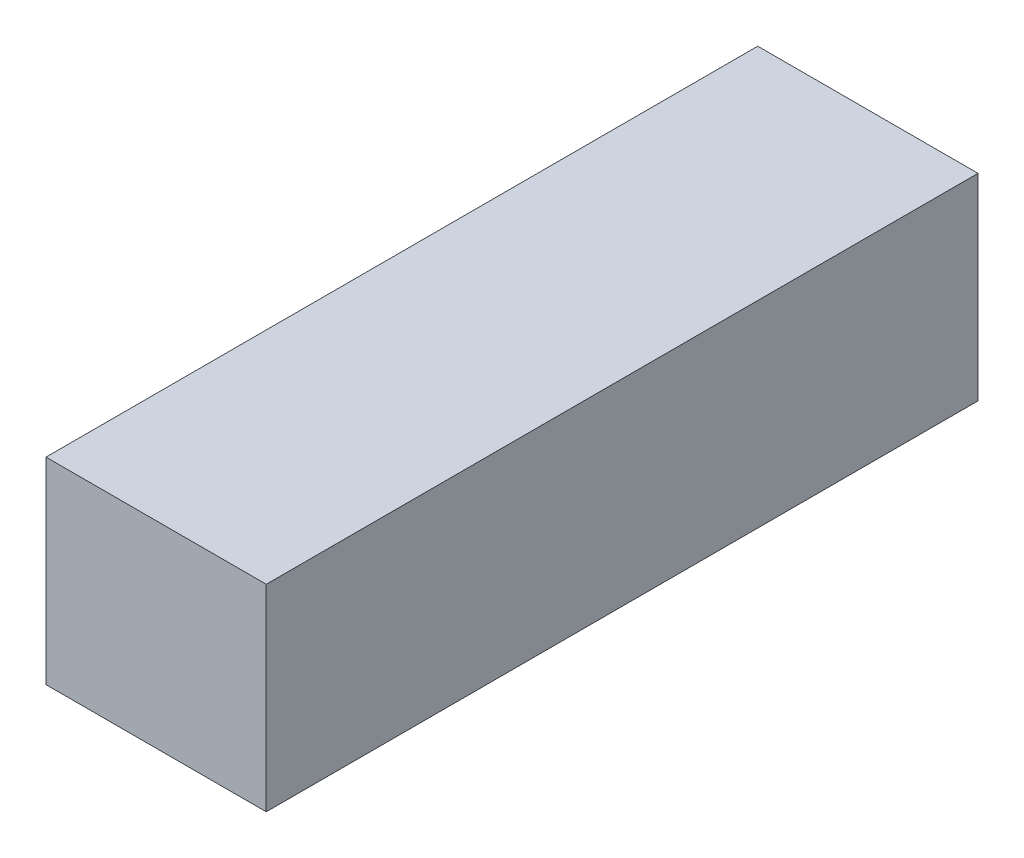
ISO-10303-21;
HEADER;
FILE_DESCRIPTION(('STEP AP214'),'2;1');
FILE_NAME('part.step','',(''),(''),'','','');
FILE_SCHEMA(('AUTOMOTIVE_DESIGN { 1 0 10303 214 1 1 1 1 }'));
ENDSEC;
DATA;
#1=APPLICATION_CONTEXT('core data for automotive mechanical design processes');
#2=APPLICATION_PROTOCOL_DEFINITION('international standard','automotive_design',2000,#1);
#3=PRODUCT_CONTEXT('',#1,'mechanical');
#4=PRODUCT('Part','Part','',(#3));
#5=PRODUCT_RELATED_PRODUCT_CATEGORY('part','',(#4));
#6=PRODUCT_DEFINITION_FORMATION('','',#4);
#7=PRODUCT_DEFINITION_CONTEXT('part definition',#1,'design');
#8=PRODUCT_DEFINITION('design','',#6,#7);
#9=PRODUCT_DEFINITION_SHAPE('','',#8);
#10=(LENGTH_UNIT() NAMED_UNIT(*) SI_UNIT(.MILLI.,.METRE.));
#11=(NAMED_UNIT(*) PLANE_ANGLE_UNIT() SI_UNIT($,.RADIAN.));
#12=(NAMED_UNIT(*) SI_UNIT($,.STERADIAN.) SOLID_ANGLE_UNIT());
#13=UNCERTAINTY_MEASURE_WITH_UNIT(LENGTH_MEASURE(1.E-05),#10,'distance_accuracy_value','');
#14=(GEOMETRIC_REPRESENTATION_CONTEXT(3) GLOBAL_UNCERTAINTY_ASSIGNED_CONTEXT((#13)) GLOBAL_UNIT_ASSIGNED_CONTEXT((#10,
#11,#12)) REPRESENTATION_CONTEXT('',''));
#15=CARTESIAN_POINT('',(0.,0.,0.));
#16=DIRECTION('',(0.,0.,1.));
#17=DIRECTION('',(1.,0.,0.));
#18=AXIS2_PLACEMENT_3D('',#15,#16,#17);
#19=CARTESIAN_POINT('',(0.,43.18,0.));
#20=DIRECTION('',(1.,0.,0.));
#21=DIRECTION('',(0.,0.,-1.));
#22=AXIS2_PLACEMENT_3D('',#19,#20,#21);
#23=PLANE('',#22);
#24=DIRECTION('',(0.,0.,1.));
#25=VECTOR('',#24,1.);
#26=CARTESIAN_POINT('',(0.,0.,0.));
#27=LINE('',#26,#25);
#28=CARTESIAN_POINT('',(0.,0.,-155.956));
#29=VERTEX_POINT('',#28);
#30=CARTESIAN_POINT('',(0.,0.,0.));
#31=VERTEX_POINT('',#30);
#32=EDGE_CURVE('E103',#29,#31,#27,.T.);
#33=ORIENTED_EDGE('',*,*,#32,.T.);
#34=DIRECTION('',(0.,-1.,0.));
#35=VECTOR('',#34,1.);
#36=CARTESIAN_POINT('',(0.,43.18,0.));
#37=LINE('',#36,#35);
#38=CARTESIAN_POINT('',(0.,43.18,0.));
#39=VERTEX_POINT('',#38);
#40=EDGE_CURVE('E11',#39,#31,#37,.T.);
#41=ORIENTED_EDGE('',*,*,#40,.F.);
#42=DIRECTION('',(0.,0.,1.));
#43=VECTOR('',#42,1.);
#44=CARTESIAN_POINT('',(0.,43.18,0.));
#45=LINE('',#44,#43);
#46=CARTESIAN_POINT('',(0.,43.18,-155.956));
#47=VERTEX_POINT('',#46);
#48=EDGE_CURVE('E91',#47,#39,#45,.T.);
#49=ORIENTED_EDGE('',*,*,#48,.F.);
#50=DIRECTION('',(0.,-1.,0.));
#51=VECTOR('',#50,1.);
#52=CARTESIAN_POINT('',(0.,43.18,-155.956));
#53=LINE('',#52,#51);
#54=EDGE_CURVE('E99',#47,#29,#53,.T.);
#55=ORIENTED_EDGE('',*,*,#54,.T.);
#56=EDGE_LOOP('',(#33,#41,#49,#55));
#57=FACE_BOUND('',#56,.T.);
#58=ADVANCED_FACE('F40',(#57),#23,.F.);
#59=CARTESIAN_POINT('',(0.,43.18,0.));
#60=DIRECTION('',(0.,0.,-1.));
#61=DIRECTION('',(-1.,0.,0.));
#62=AXIS2_PLACEMENT_3D('',#59,#60,#61);
#63=PLANE('',#62);
#64=DIRECTION('',(1.,0.,0.));
#65=VECTOR('',#64,1.);
#66=CARTESIAN_POINT('',(0.,0.,0.));
#67=LINE('',#66,#65);
#68=CARTESIAN_POINT('',(48.26,0.,0.));
#69=VERTEX_POINT('',#68);
#70=EDGE_CURVE('E95',#31,#69,#67,.T.);
#71=ORIENTED_EDGE('',*,*,#70,.T.);
#72=DIRECTION('',(0.,-1.,0.));
#73=VECTOR('',#72,1.);
#74=CARTESIAN_POINT('',(48.26,43.18,0.));
#75=LINE('',#74,#73);
#76=CARTESIAN_POINT('',(48.26,43.18,0.));
#77=VERTEX_POINT('',#76);
#78=EDGE_CURVE('E48',#77,#69,#75,.T.);
#79=ORIENTED_EDGE('',*,*,#78,.F.);
#80=DIRECTION('',(1.,0.,0.));
#81=VECTOR('',#80,1.);
#82=CARTESIAN_POINT('',(0.,43.18,0.));
#83=LINE('',#82,#81);
#84=EDGE_CURVE('E86',#39,#77,#83,.T.);
#85=ORIENTED_EDGE('',*,*,#84,.F.);
#86=ORIENTED_EDGE('',*,*,#40,.T.);
#87=EDGE_LOOP('',(#71,#79,#85,#86));
#88=FACE_BOUND('',#87,.T.);
#89=ADVANCED_FACE('F94',(#88),#63,.F.);
#90=CARTESIAN_POINT('',(48.26,43.18,0.));
#91=DIRECTION('',(-1.,0.,0.));
#92=DIRECTION('',(0.,0.,1.));
#93=AXIS2_PLACEMENT_3D('',#90,#91,#92);
#94=PLANE('',#93);
#95=DIRECTION('',(0.,0.,-1.));
#96=VECTOR('',#95,1.);
#97=CARTESIAN_POINT('',(48.26,0.,0.));
#98=LINE('',#97,#96);
#99=CARTESIAN_POINT('',(48.26,0.,-155.956));
#100=VERTEX_POINT('',#99);
#101=EDGE_CURVE('E73',#69,#100,#98,.T.);
#102=ORIENTED_EDGE('',*,*,#101,.T.);
#103=DIRECTION('',(0.,-1.,0.));
#104=VECTOR('',#103,1.);
#105=CARTESIAN_POINT('',(48.26,43.18,-155.956));
#106=LINE('',#105,#104);
#107=CARTESIAN_POINT('',(48.26,43.18,-155.956));
#108=VERTEX_POINT('',#107);
#109=EDGE_CURVE('E96',#108,#100,#106,.T.);
#110=ORIENTED_EDGE('',*,*,#109,.F.);
#111=DIRECTION('',(0.,0.,-1.));
#112=VECTOR('',#111,1.);
#113=CARTESIAN_POINT('',(48.26,43.18,0.));
#114=LINE('',#113,#112);
#115=EDGE_CURVE('E89',#77,#108,#114,.T.);
#116=ORIENTED_EDGE('',*,*,#115,.F.);
#117=ORIENTED_EDGE('',*,*,#78,.T.);
#118=EDGE_LOOP('',(#102,#110,#116,#117));
#119=FACE_BOUND('',#118,.T.);
#120=ADVANCED_FACE('F97',(#119),#94,.F.);
#121=CARTESIAN_POINT('',(0.,43.18,-155.956));
#122=DIRECTION('',(0.,0.,1.));
#123=DIRECTION('',(1.,0.,0.));
#124=AXIS2_PLACEMENT_3D('',#121,#122,#123);
#125=PLANE('',#124);
#126=DIRECTION('',(-1.,0.,0.));
#127=VECTOR('',#126,1.);
#128=CARTESIAN_POINT('',(0.,0.,-155.956));
#129=LINE('',#128,#127);
#130=EDGE_CURVE('E79',#100,#29,#129,.T.);
#131=ORIENTED_EDGE('',*,*,#130,.T.);
#132=ORIENTED_EDGE('',*,*,#54,.F.);
#133=DIRECTION('',(-1.,0.,0.));
#134=VECTOR('',#133,1.);
#135=CARTESIAN_POINT('',(0.,43.18,-155.956));
#136=LINE('',#135,#134);
#137=EDGE_CURVE('E56',#108,#47,#136,.T.);
#138=ORIENTED_EDGE('',*,*,#137,.F.);
#139=ORIENTED_EDGE('',*,*,#109,.T.);
#140=EDGE_LOOP('',(#131,#132,#138,#139));
#141=FACE_BOUND('',#140,.T.);
#142=ADVANCED_FACE('F110',(#141),#125,.F.);
#143=CARTESIAN_POINT('',(0.,43.18,0.));
#144=DIRECTION('',(0.,-1.,0.));
#145=DIRECTION('',(0.,0.,-1.));
#146=AXIS2_PLACEMENT_3D('',#143,#144,#145);
#147=PLANE('',#146);
#148=ORIENTED_EDGE('',*,*,#48,.T.);
#149=ORIENTED_EDGE('',*,*,#84,.T.);
#150=ORIENTED_EDGE('',*,*,#115,.T.);
#151=ORIENTED_EDGE('',*,*,#137,.T.);
#152=EDGE_LOOP('',(#148,#149,#150,#151));
#153=FACE_BOUND('',#152,.T.);
#154=ADVANCED_FACE('F87',(#153),#147,.F.);
#155=CARTESIAN_POINT('',(0.,0.,0.));
#156=DIRECTION('',(0.,-1.,0.));
#157=DIRECTION('',(0.,0.,-1.));
#158=AXIS2_PLACEMENT_3D('',#155,#156,#157);
#159=PLANE('',#158);
#160=ORIENTED_EDGE('',*,*,#32,.F.);
#161=ORIENTED_EDGE('',*,*,#130,.F.);
#162=ORIENTED_EDGE('',*,*,#101,.F.);
#163=ORIENTED_EDGE('',*,*,#70,.F.);
#164=EDGE_LOOP('',(#160,#161,#162,#163));
#165=FACE_BOUND('',#164,.T.);
#166=ADVANCED_FACE('F113',(#165),#159,.T.);
#167=CLOSED_SHELL('',(#58,#89,#120,#142,#154,#166));
#168=MANIFOLD_SOLID_BREP('B2',#167);
#169=ADVANCED_BREP_SHAPE_REPRESENTATION('',(#18,#168),#14);
#170=SHAPE_DEFINITION_REPRESENTATION(#9,#169);
ENDSEC;
END-ISO-10303-21;
